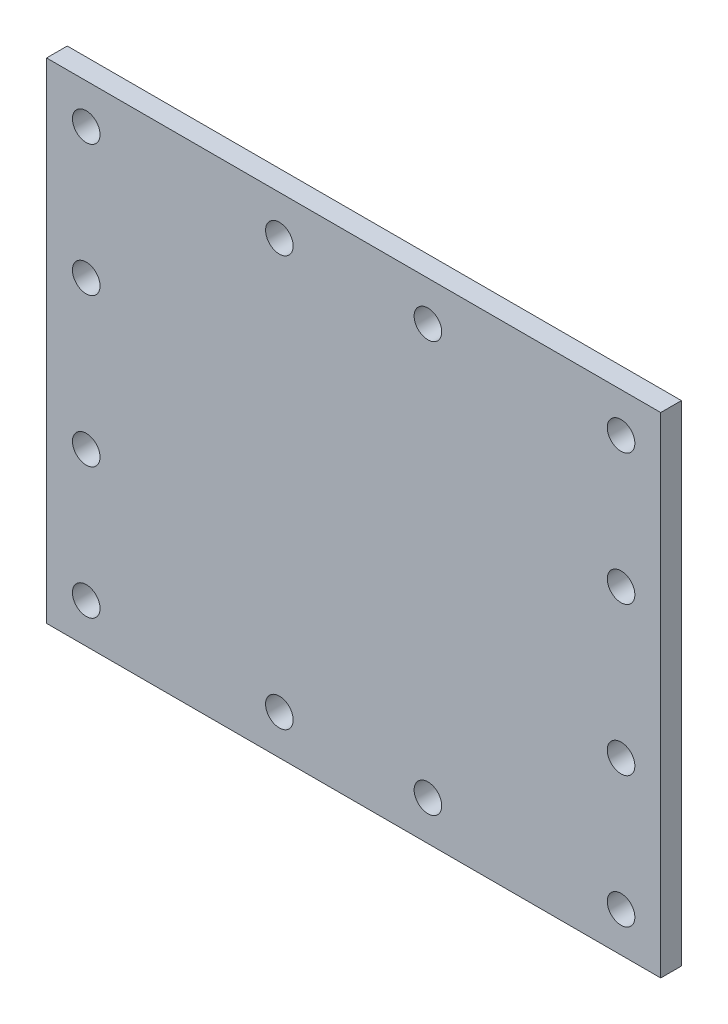
ISO-10303-21;
HEADER;
FILE_DESCRIPTION(('STEP AP214'),'2;1');
FILE_NAME('part.step','',(''),(''),'','','');
FILE_SCHEMA(('AUTOMOTIVE_DESIGN { 1 0 10303 214 1 1 1 1 }'));
ENDSEC;
DATA;
#1=APPLICATION_CONTEXT('core data for automotive mechanical design processes');
#2=APPLICATION_PROTOCOL_DEFINITION('international standard','automotive_design',2000,#1);
#3=PRODUCT_CONTEXT('',#1,'mechanical');
#4=PRODUCT('Part','Part','',(#3));
#5=PRODUCT_RELATED_PRODUCT_CATEGORY('part','',(#4));
#6=PRODUCT_DEFINITION_FORMATION('','',#4);
#7=PRODUCT_DEFINITION_CONTEXT('part definition',#1,'design');
#8=PRODUCT_DEFINITION('design','',#6,#7);
#9=PRODUCT_DEFINITION_SHAPE('','',#8);
#10=(LENGTH_UNIT() NAMED_UNIT(*) SI_UNIT(.MILLI.,.METRE.));
#11=(NAMED_UNIT(*) PLANE_ANGLE_UNIT() SI_UNIT($,.RADIAN.));
#12=(NAMED_UNIT(*) SI_UNIT($,.STERADIAN.) SOLID_ANGLE_UNIT());
#13=UNCERTAINTY_MEASURE_WITH_UNIT(LENGTH_MEASURE(1.E-05),#10,'distance_accuracy_value','');
#14=(GEOMETRIC_REPRESENTATION_CONTEXT(3) GLOBAL_UNCERTAINTY_ASSIGNED_CONTEXT((#13)) GLOBAL_UNIT_ASSIGNED_CONTEXT((#10,
#11,#12)) REPRESENTATION_CONTEXT('',''));
#15=CARTESIAN_POINT('',(0.,0.,0.));
#16=DIRECTION('',(0.,0.,1.));
#17=DIRECTION('',(1.,0.,0.));
#18=AXIS2_PLACEMENT_3D('',#15,#16,#17);
#19=CARTESIAN_POINT('',(-146.414312824647,106.491954424767,-2.51040500289528));
#20=DIRECTION('',(0.,1.,0.));
#21=DIRECTION('',(-1.,0.,0.));
#22=AXIS2_PLACEMENT_3D('',#19,#20,#21);
#23=PLANE('',#22);
#24=DIRECTION('',(1.,0.,0.));
#25=VECTOR('',#24,1.);
#26=CARTESIAN_POINT('',(-146.414312824647,106.491954424767,-5.51040500289528));
#27=LINE('',#26,#25);
#28=CARTESIAN_POINT('',(-146.414312824647,106.491954424767,-5.51040500289528));
#29=VERTEX_POINT('',#28);
#30=CARTESIAN_POINT('',(-57.3743128246472,106.491954424767,-5.51040500289528));
#31=VERTEX_POINT('',#30);
#32=EDGE_CURVE('E100',#29,#31,#27,.T.);
#33=ORIENTED_EDGE('',*,*,#32,.F.);
#34=DIRECTION('',(0.,0.,-1.));
#35=VECTOR('',#34,1.);
#36=CARTESIAN_POINT('',(-146.414312824647,106.491954424767,-2.51040500289528));
#37=LINE('',#36,#35);
#38=CARTESIAN_POINT('',(-146.414312824647,106.491954424767,-2.51040500289528));
#39=VERTEX_POINT('',#38);
#40=EDGE_CURVE('E11',#39,#29,#37,.T.);
#41=ORIENTED_EDGE('',*,*,#40,.F.);
#42=DIRECTION('',(1.,0.,0.));
#43=VECTOR('',#42,1.);
#44=CARTESIAN_POINT('',(-146.414312824647,106.491954424767,-2.51040500289528));
#45=LINE('',#44,#43);
#46=CARTESIAN_POINT('',(-57.3743128246472,106.491954424767,-2.51040500289528));
#47=VERTEX_POINT('',#46);
#48=EDGE_CURVE('E93',#39,#47,#45,.T.);
#49=ORIENTED_EDGE('',*,*,#48,.T.);
#50=DIRECTION('',(0.,0.,-1.));
#51=VECTOR('',#50,1.);
#52=CARTESIAN_POINT('',(-57.3743128246472,106.491954424767,-2.51040500289528));
#53=LINE('',#52,#51);
#54=EDGE_CURVE('E38',#47,#31,#53,.T.);
#55=ORIENTED_EDGE('',*,*,#54,.T.);
#56=EDGE_LOOP('',(#33,#41,#49,#55));
#57=FACE_BOUND('',#56,.T.);
#58=ADVANCED_FACE('F35',(#57),#23,.T.);
#59=CARTESIAN_POINT('',(-146.414312824647,35.4943544247679,-2.51040500289528));
#60=DIRECTION('',(-1.,0.,0.));
#61=DIRECTION('',(0.,0.,1.));
#62=AXIS2_PLACEMENT_3D('',#59,#60,#61);
#63=PLANE('',#62);
#64=DIRECTION('',(0.,1.,0.));
#65=VECTOR('',#64,1.);
#66=CARTESIAN_POINT('',(-146.414312824647,35.4943544247679,-5.51040500289528));
#67=LINE('',#66,#65);
#68=CARTESIAN_POINT('',(-146.414312824647,35.4943544247679,-5.51040500289528));
#69=VERTEX_POINT('',#68);
#70=EDGE_CURVE('E95',#69,#29,#67,.T.);
#71=ORIENTED_EDGE('',*,*,#70,.F.);
#72=DIRECTION('',(0.,0.,-1.));
#73=VECTOR('',#72,1.);
#74=CARTESIAN_POINT('',(-146.414312824647,35.4943544247679,-2.51040500289528));
#75=LINE('',#74,#73);
#76=CARTESIAN_POINT('',(-146.414312824647,35.4943544247679,-2.51040500289528));
#77=VERTEX_POINT('',#76);
#78=EDGE_CURVE('E44',#77,#69,#75,.T.);
#79=ORIENTED_EDGE('',*,*,#78,.F.);
#80=DIRECTION('',(0.,1.,0.));
#81=VECTOR('',#80,1.);
#82=CARTESIAN_POINT('',(-146.414312824647,35.4943544247679,-2.51040500289528));
#83=LINE('',#82,#81);
#84=EDGE_CURVE('E90',#77,#39,#83,.T.);
#85=ORIENTED_EDGE('',*,*,#84,.T.);
#86=ORIENTED_EDGE('',*,*,#40,.T.);
#87=EDGE_LOOP('',(#71,#79,#85,#86));
#88=FACE_BOUND('',#87,.T.);
#89=ADVANCED_FACE('F111',(#88),#63,.T.);
#90=CARTESIAN_POINT('',(-57.3743128246472,35.4943544247679,-2.51040500289528));
#91=DIRECTION('',(0.,-1.,0.));
#92=DIRECTION('',(1.,0.,0.));
#93=AXIS2_PLACEMENT_3D('',#90,#91,#92);
#94=PLANE('',#93);
#95=DIRECTION('',(-1.,0.,0.));
#96=VECTOR('',#95,1.);
#97=CARTESIAN_POINT('',(-57.3743128246472,35.4943544247679,-5.51040500289528));
#98=LINE('',#97,#96);
#99=CARTESIAN_POINT('',(-57.3743128246472,35.4943544247679,-5.51040500289528));
#100=VERTEX_POINT('',#99);
#101=EDGE_CURVE('E85',#100,#69,#98,.T.);
#102=ORIENTED_EDGE('',*,*,#101,.F.);
#103=DIRECTION('',(0.,0.,-1.));
#104=VECTOR('',#103,1.);
#105=CARTESIAN_POINT('',(-57.3743128246472,35.4943544247679,-2.51040500289528));
#106=LINE('',#105,#104);
#107=CARTESIAN_POINT('',(-57.3743128246472,35.4943544247679,-2.51040500289528));
#108=VERTEX_POINT('',#107);
#109=EDGE_CURVE('E80',#108,#100,#106,.T.);
#110=ORIENTED_EDGE('',*,*,#109,.F.);
#111=DIRECTION('',(-1.,0.,0.));
#112=VECTOR('',#111,1.);
#113=CARTESIAN_POINT('',(-57.3743128246472,35.4943544247679,-2.51040500289528));
#114=LINE('',#113,#112);
#115=EDGE_CURVE('E83',#108,#77,#114,.T.);
#116=ORIENTED_EDGE('',*,*,#115,.T.);
#117=ORIENTED_EDGE('',*,*,#78,.T.);
#118=EDGE_LOOP('',(#102,#110,#116,#117));
#119=FACE_BOUND('',#118,.T.);
#120=ADVANCED_FACE('F82',(#119),#94,.T.);
#121=CARTESIAN_POINT('',(-57.3743128246472,106.491954424767,-2.51040500289528));
#122=DIRECTION('',(1.,0.,0.));
#123=DIRECTION('',(0.,1.,0.));
#124=AXIS2_PLACEMENT_3D('',#121,#122,#123);
#125=PLANE('',#124);
#126=DIRECTION('',(0.,-1.,0.));
#127=VECTOR('',#126,1.);
#128=CARTESIAN_POINT('',(-57.3743128246472,106.491954424767,-5.51040500289528));
#129=LINE('',#128,#127);
#130=EDGE_CURVE('E103',#31,#100,#129,.T.);
#131=ORIENTED_EDGE('',*,*,#130,.F.);
#132=ORIENTED_EDGE('',*,*,#54,.F.);
#133=DIRECTION('',(0.,-1.,0.));
#134=VECTOR('',#133,1.);
#135=CARTESIAN_POINT('',(-57.3743128246472,106.491954424767,-2.51040500289528));
#136=LINE('',#135,#134);
#137=EDGE_CURVE('E89',#47,#108,#136,.T.);
#138=ORIENTED_EDGE('',*,*,#137,.T.);
#139=ORIENTED_EDGE('',*,*,#109,.T.);
#140=EDGE_LOOP('',(#131,#132,#138,#139));
#141=FACE_BOUND('',#140,.T.);
#142=ADVANCED_FACE('F92',(#141),#125,.T.);
#143=CARTESIAN_POINT('',(0.,0.,-2.51040500289528));
#144=DIRECTION('',(0.,0.,-1.));
#145=DIRECTION('',(-1.,0.,0.));
#146=AXIS2_PLACEMENT_3D('',#143,#144,#145);
#147=PLANE('',#146);
#148=CARTESIAN_POINT('',(-112.664312824647,100.741954424767,-2.51040500289528));
#149=DIRECTION('',(0.,0.,-1.));
#150=DIRECTION('',(-1.,0.,0.));
#151=AXIS2_PLACEMENT_3D('',#148,#149,#150);
#152=CIRCLE('',#151,2.);
#153=CARTESIAN_POINT('',(-114.664312824647,100.741954424767,-2.51040500289528));
#154=VERTEX_POINT('',#153);
#155=EDGE_CURVE('E184',#154,#154,#152,.T.);
#156=ORIENTED_EDGE('',*,*,#155,.T.);
#157=EDGE_LOOP('',(#156));
#158=FACE_BOUND('',#157,.T.);
#159=CARTESIAN_POINT('',(-91.1243128246472,100.741954424767,-2.51040500289528));
#160=DIRECTION('',(0.,0.,-1.));
#161=DIRECTION('',(-1.,0.,0.));
#162=AXIS2_PLACEMENT_3D('',#159,#160,#161);
#163=CIRCLE('',#162,2.);
#164=CARTESIAN_POINT('',(-93.1243128246472,100.741954424767,-2.51040500289528));
#165=VERTEX_POINT('',#164);
#166=EDGE_CURVE('E192',#165,#165,#163,.T.);
#167=ORIENTED_EDGE('',*,*,#166,.T.);
#168=EDGE_LOOP('',(#167));
#169=FACE_BOUND('',#168,.T.);
#170=CARTESIAN_POINT('',(-63.1243128246472,100.741954424767,-2.51040500289528));
#171=DIRECTION('',(0.,0.,-1.));
#172=DIRECTION('',(-1.,0.,0.));
#173=AXIS2_PLACEMENT_3D('',#170,#171,#172);
#174=CIRCLE('',#173,1.99999999999998);
#175=CARTESIAN_POINT('',(-65.1243128246472,100.741954424767,-2.51040500289528));
#176=VERTEX_POINT('',#175);
#177=EDGE_CURVE('E198',#176,#176,#174,.T.);
#178=ORIENTED_EDGE('',*,*,#177,.T.);
#179=EDGE_LOOP('',(#178));
#180=FACE_BOUND('',#179,.T.);
#181=CARTESIAN_POINT('',(-63.1243128246471,81.7419544247674,-2.51040500289528));
#182=DIRECTION('',(0.,0.,-1.));
#183=DIRECTION('',(-1.,0.,0.));
#184=AXIS2_PLACEMENT_3D('',#181,#182,#183);
#185=CIRCLE('',#184,1.99999999999998);
#186=CARTESIAN_POINT('',(-65.1243128246471,81.7419544247674,-2.51040500289528));
#187=VERTEX_POINT('',#186);
#188=EDGE_CURVE('E204',#187,#187,#185,.T.);
#189=ORIENTED_EDGE('',*,*,#188,.T.);
#190=EDGE_LOOP('',(#189));
#191=FACE_BOUND('',#190,.T.);
#192=CARTESIAN_POINT('',(-63.1243128246471,60.2443544247679,-2.51040500289528));
#193=DIRECTION('',(0.,0.,-1.));
#194=DIRECTION('',(-1.,0.,0.));
#195=AXIS2_PLACEMENT_3D('',#192,#193,#194);
#196=CIRCLE('',#195,1.99999999999998);
#197=CARTESIAN_POINT('',(-65.1243128246471,60.2443544247679,-2.51040500289528));
#198=VERTEX_POINT('',#197);
#199=EDGE_CURVE('E210',#198,#198,#196,.T.);
#200=ORIENTED_EDGE('',*,*,#199,.T.);
#201=EDGE_LOOP('',(#200));
#202=FACE_BOUND('',#201,.T.);
#203=CARTESIAN_POINT('',(-63.1243128246472,41.2443544247679,-2.51040500289528));
#204=DIRECTION('',(0.,0.,-1.));
#205=DIRECTION('',(-1.,0.,0.));
#206=AXIS2_PLACEMENT_3D('',#203,#204,#205);
#207=CIRCLE('',#206,1.99999999999998);
#208=CARTESIAN_POINT('',(-65.1243128246472,41.2443544247679,-2.51040500289528));
#209=VERTEX_POINT('',#208);
#210=EDGE_CURVE('E216',#209,#209,#207,.T.);
#211=ORIENTED_EDGE('',*,*,#210,.T.);
#212=EDGE_LOOP('',(#211));
#213=FACE_BOUND('',#212,.T.);
#214=CARTESIAN_POINT('',(-91.1243128246472,41.2443544247679,-2.51040500289528));
#215=DIRECTION('',(0.,0.,-1.));
#216=DIRECTION('',(-1.,0.,0.));
#217=AXIS2_PLACEMENT_3D('',#214,#215,#216);
#218=CIRCLE('',#217,2.);
#219=CARTESIAN_POINT('',(-93.1243128246472,41.2443544247679,-2.51040500289528));
#220=VERTEX_POINT('',#219);
#221=EDGE_CURVE('E222',#220,#220,#218,.T.);
#222=ORIENTED_EDGE('',*,*,#221,.T.);
#223=EDGE_LOOP('',(#222));
#224=FACE_BOUND('',#223,.T.);
#225=CARTESIAN_POINT('',(-112.664312824647,41.2443544247679,-2.51040500289528));
#226=DIRECTION('',(0.,0.,-1.));
#227=DIRECTION('',(-1.,0.,0.));
#228=AXIS2_PLACEMENT_3D('',#225,#226,#227);
#229=CIRCLE('',#228,2.);
#230=CARTESIAN_POINT('',(-114.664312824647,41.2443544247679,-2.51040500289528));
#231=VERTEX_POINT('',#230);
#232=EDGE_CURVE('E228',#231,#231,#229,.T.);
#233=ORIENTED_EDGE('',*,*,#232,.T.);
#234=EDGE_LOOP('',(#233));
#235=FACE_BOUND('',#234,.T.);
#236=CARTESIAN_POINT('',(-140.664312824647,41.2443544247679,-2.51040500289528));
#237=DIRECTION('',(0.,0.,-1.));
#238=DIRECTION('',(-1.,0.,0.));
#239=AXIS2_PLACEMENT_3D('',#236,#237,#238);
#240=CIRCLE('',#239,2.);
#241=CARTESIAN_POINT('',(-142.664312824647,41.2443544247679,-2.51040500289528));
#242=VERTEX_POINT('',#241);
#243=EDGE_CURVE('E234',#242,#242,#240,.T.);
#244=ORIENTED_EDGE('',*,*,#243,.T.);
#245=EDGE_LOOP('',(#244));
#246=FACE_BOUND('',#245,.T.);
#247=CARTESIAN_POINT('',(-140.664312824647,60.2443544247679,-2.51040500289528));
#248=DIRECTION('',(0.,0.,-1.));
#249=DIRECTION('',(-1.,0.,0.));
#250=AXIS2_PLACEMENT_3D('',#247,#248,#249);
#251=CIRCLE('',#250,2.);
#252=CARTESIAN_POINT('',(-142.664312824647,60.2443544247679,-2.51040500289528));
#253=VERTEX_POINT('',#252);
#254=EDGE_CURVE('E240',#253,#253,#251,.T.);
#255=ORIENTED_EDGE('',*,*,#254,.T.);
#256=EDGE_LOOP('',(#255));
#257=FACE_BOUND('',#256,.T.);
#258=CARTESIAN_POINT('',(-140.664312824647,100.741954424767,-2.51040500289528));
#259=DIRECTION('',(0.,0.,-1.));
#260=DIRECTION('',(-1.,0.,0.));
#261=AXIS2_PLACEMENT_3D('',#258,#259,#260);
#262=CIRCLE('',#261,2.);
#263=CARTESIAN_POINT('',(-142.664312824647,100.741954424767,-2.51040500289528));
#264=VERTEX_POINT('',#263);
#265=EDGE_CURVE('E246',#264,#264,#262,.T.);
#266=ORIENTED_EDGE('',*,*,#265,.T.);
#267=EDGE_LOOP('',(#266));
#268=FACE_BOUND('',#267,.T.);
#269=CARTESIAN_POINT('',(-140.664312824647,81.7419544247674,-2.51040500289528));
#270=DIRECTION('',(0.,0.,-1.));
#271=DIRECTION('',(-1.,0.,0.));
#272=AXIS2_PLACEMENT_3D('',#269,#270,#271);
#273=CIRCLE('',#272,2.);
#274=CARTESIAN_POINT('',(-142.664312824647,81.7419544247674,-2.51040500289528));
#275=VERTEX_POINT('',#274);
#276=EDGE_CURVE('E104',#275,#275,#273,.T.);
#277=ORIENTED_EDGE('',*,*,#276,.T.);
#278=EDGE_LOOP('',(#277));
#279=FACE_BOUND('',#278,.T.);
#280=ORIENTED_EDGE('',*,*,#48,.F.);
#281=ORIENTED_EDGE('',*,*,#84,.F.);
#282=ORIENTED_EDGE('',*,*,#115,.F.);
#283=ORIENTED_EDGE('',*,*,#137,.F.);
#284=EDGE_LOOP('',(#280,#281,#282,#283));
#285=FACE_BOUND('',#284,.T.);
#286=ADVANCED_FACE('F88',(#158,#169,#180,#191,#202,#213,#224,#235,#246,#257,#268,#279,#285),
#147,.F.);
#287=CARTESIAN_POINT('',(0.,0.,-5.51040500289528));
#288=DIRECTION('',(0.,0.,-1.));
#289=DIRECTION('',(-1.,0.,0.));
#290=AXIS2_PLACEMENT_3D('',#287,#288,#289);
#291=PLANE('',#290);
#292=CARTESIAN_POINT('',(-112.664312824647,100.741954424767,-5.51040500289528));
#293=DIRECTION('',(0.,0.,-1.));
#294=DIRECTION('',(-1.,0.,0.));
#295=AXIS2_PLACEMENT_3D('',#292,#293,#294);
#296=CIRCLE('',#295,2.);
#297=CARTESIAN_POINT('',(-114.664312824647,100.741954424767,-5.51040500289528));
#298=VERTEX_POINT('',#297);
#299=EDGE_CURVE('E187',#298,#298,#296,.T.);
#300=ORIENTED_EDGE('',*,*,#299,.F.);
#301=EDGE_LOOP('',(#300));
#302=FACE_BOUND('',#301,.T.);
#303=CARTESIAN_POINT('',(-91.1243128246472,100.741954424767,-5.51040500289528));
#304=DIRECTION('',(0.,0.,-1.));
#305=DIRECTION('',(-1.,0.,0.));
#306=AXIS2_PLACEMENT_3D('',#303,#304,#305);
#307=CIRCLE('',#306,2.);
#308=CARTESIAN_POINT('',(-93.1243128246472,100.741954424767,-5.51040500289528));
#309=VERTEX_POINT('',#308);
#310=EDGE_CURVE('E189',#309,#309,#307,.T.);
#311=ORIENTED_EDGE('',*,*,#310,.F.);
#312=EDGE_LOOP('',(#311));
#313=FACE_BOUND('',#312,.T.);
#314=CARTESIAN_POINT('',(-63.1243128246472,100.741954424767,-5.51040500289528));
#315=DIRECTION('',(0.,0.,-1.));
#316=DIRECTION('',(-1.,0.,0.));
#317=AXIS2_PLACEMENT_3D('',#314,#315,#316);
#318=CIRCLE('',#317,1.99999999999998);
#319=CARTESIAN_POINT('',(-65.1243128246472,100.741954424767,-5.51040500289528));
#320=VERTEX_POINT('',#319);
#321=EDGE_CURVE('E195',#320,#320,#318,.T.);
#322=ORIENTED_EDGE('',*,*,#321,.F.);
#323=EDGE_LOOP('',(#322));
#324=FACE_BOUND('',#323,.T.);
#325=CARTESIAN_POINT('',(-63.1243128246471,81.7419544247674,-5.51040500289528));
#326=DIRECTION('',(0.,0.,-1.));
#327=DIRECTION('',(-1.,0.,0.));
#328=AXIS2_PLACEMENT_3D('',#325,#326,#327);
#329=CIRCLE('',#328,1.99999999999998);
#330=CARTESIAN_POINT('',(-65.1243128246471,81.7419544247674,-5.51040500289528));
#331=VERTEX_POINT('',#330);
#332=EDGE_CURVE('E201',#331,#331,#329,.T.);
#333=ORIENTED_EDGE('',*,*,#332,.F.);
#334=EDGE_LOOP('',(#333));
#335=FACE_BOUND('',#334,.T.);
#336=CARTESIAN_POINT('',(-63.1243128246471,60.2443544247679,-5.51040500289528));
#337=DIRECTION('',(0.,0.,-1.));
#338=DIRECTION('',(-1.,0.,0.));
#339=AXIS2_PLACEMENT_3D('',#336,#337,#338);
#340=CIRCLE('',#339,1.99999999999998);
#341=CARTESIAN_POINT('',(-65.1243128246471,60.2443544247679,-5.51040500289528));
#342=VERTEX_POINT('',#341);
#343=EDGE_CURVE('E207',#342,#342,#340,.T.);
#344=ORIENTED_EDGE('',*,*,#343,.F.);
#345=EDGE_LOOP('',(#344));
#346=FACE_BOUND('',#345,.T.);
#347=CARTESIAN_POINT('',(-63.1243128246472,41.2443544247679,-5.51040500289528));
#348=DIRECTION('',(0.,0.,-1.));
#349=DIRECTION('',(-1.,0.,0.));
#350=AXIS2_PLACEMENT_3D('',#347,#348,#349);
#351=CIRCLE('',#350,1.99999999999998);
#352=CARTESIAN_POINT('',(-65.1243128246472,41.2443544247679,-5.51040500289528));
#353=VERTEX_POINT('',#352);
#354=EDGE_CURVE('E213',#353,#353,#351,.T.);
#355=ORIENTED_EDGE('',*,*,#354,.F.);
#356=EDGE_LOOP('',(#355));
#357=FACE_BOUND('',#356,.T.);
#358=CARTESIAN_POINT('',(-91.1243128246472,41.2443544247679,-5.51040500289528));
#359=DIRECTION('',(0.,0.,-1.));
#360=DIRECTION('',(-1.,0.,0.));
#361=AXIS2_PLACEMENT_3D('',#358,#359,#360);
#362=CIRCLE('',#361,2.);
#363=CARTESIAN_POINT('',(-93.1243128246472,41.2443544247679,-5.51040500289528));
#364=VERTEX_POINT('',#363);
#365=EDGE_CURVE('E219',#364,#364,#362,.T.);
#366=ORIENTED_EDGE('',*,*,#365,.F.);
#367=EDGE_LOOP('',(#366));
#368=FACE_BOUND('',#367,.T.);
#369=CARTESIAN_POINT('',(-112.664312824647,41.2443544247679,-5.51040500289528));
#370=DIRECTION('',(0.,0.,-1.));
#371=DIRECTION('',(-1.,0.,0.));
#372=AXIS2_PLACEMENT_3D('',#369,#370,#371);
#373=CIRCLE('',#372,2.);
#374=CARTESIAN_POINT('',(-114.664312824647,41.2443544247679,-5.51040500289528));
#375=VERTEX_POINT('',#374);
#376=EDGE_CURVE('E225',#375,#375,#373,.T.);
#377=ORIENTED_EDGE('',*,*,#376,.F.);
#378=EDGE_LOOP('',(#377));
#379=FACE_BOUND('',#378,.T.);
#380=CARTESIAN_POINT('',(-140.664312824647,41.2443544247679,-5.51040500289528));
#381=DIRECTION('',(0.,0.,-1.));
#382=DIRECTION('',(-1.,0.,0.));
#383=AXIS2_PLACEMENT_3D('',#380,#381,#382);
#384=CIRCLE('',#383,2.);
#385=CARTESIAN_POINT('',(-142.664312824647,41.2443544247679,-5.51040500289528));
#386=VERTEX_POINT('',#385);
#387=EDGE_CURVE('E231',#386,#386,#384,.T.);
#388=ORIENTED_EDGE('',*,*,#387,.F.);
#389=EDGE_LOOP('',(#388));
#390=FACE_BOUND('',#389,.T.);
#391=CARTESIAN_POINT('',(-140.664312824647,60.2443544247679,-5.51040500289528));
#392=DIRECTION('',(0.,0.,-1.));
#393=DIRECTION('',(-1.,0.,0.));
#394=AXIS2_PLACEMENT_3D('',#391,#392,#393);
#395=CIRCLE('',#394,2.);
#396=CARTESIAN_POINT('',(-142.664312824647,60.2443544247679,-5.51040500289528));
#397=VERTEX_POINT('',#396);
#398=EDGE_CURVE('E237',#397,#397,#395,.T.);
#399=ORIENTED_EDGE('',*,*,#398,.F.);
#400=EDGE_LOOP('',(#399));
#401=FACE_BOUND('',#400,.T.);
#402=CARTESIAN_POINT('',(-140.664312824647,100.741954424767,-5.51040500289528));
#403=DIRECTION('',(0.,0.,-1.));
#404=DIRECTION('',(-1.,0.,0.));
#405=AXIS2_PLACEMENT_3D('',#402,#403,#404);
#406=CIRCLE('',#405,2.);
#407=CARTESIAN_POINT('',(-142.664312824647,100.741954424767,-5.51040500289528));
#408=VERTEX_POINT('',#407);
#409=EDGE_CURVE('E243',#408,#408,#406,.T.);
#410=ORIENTED_EDGE('',*,*,#409,.F.);
#411=EDGE_LOOP('',(#410));
#412=FACE_BOUND('',#411,.T.);
#413=CARTESIAN_POINT('',(-140.664312824647,81.7419544247674,-5.51040500289528));
#414=DIRECTION('',(0.,0.,-1.));
#415=DIRECTION('',(-1.,0.,0.));
#416=AXIS2_PLACEMENT_3D('',#413,#414,#415);
#417=CIRCLE('',#416,2.);
#418=CARTESIAN_POINT('',(-142.664312824647,81.7419544247674,-5.51040500289528));
#419=VERTEX_POINT('',#418);
#420=EDGE_CURVE('E249',#419,#419,#417,.T.);
#421=ORIENTED_EDGE('',*,*,#420,.F.);
#422=EDGE_LOOP('',(#421));
#423=FACE_BOUND('',#422,.T.);
#424=ORIENTED_EDGE('',*,*,#32,.T.);
#425=ORIENTED_EDGE('',*,*,#130,.T.);
#426=ORIENTED_EDGE('',*,*,#101,.T.);
#427=ORIENTED_EDGE('',*,*,#70,.T.);
#428=EDGE_LOOP('',(#424,#425,#426,#427));
#429=FACE_BOUND('',#428,.T.);
#430=ADVANCED_FACE('F110',(#302,#313,#324,#335,#346,#357,#368,#379,#390,#401,#412,#423,#429),
#291,.T.);
#431=CARTESIAN_POINT('',(-140.664312824647,81.7419544247674,-2.51040500289528));
#432=DIRECTION('',(0.,0.,-1.));
#433=DIRECTION('',(-1.,0.,0.));
#434=AXIS2_PLACEMENT_3D('',#431,#432,#433);
#435=CYLINDRICAL_SURFACE('',#434,2.);
#436=ORIENTED_EDGE('',*,*,#276,.F.);
#437=EDGE_LOOP('',(#436));
#438=FACE_BOUND('',#437,.T.);
#439=ORIENTED_EDGE('',*,*,#420,.T.);
#440=EDGE_LOOP('',(#439));
#441=FACE_BOUND('',#440,.T.);
#442=ADVANCED_FACE('F129',(#438,#441),#435,.F.);
#443=CARTESIAN_POINT('',(-140.664312824647,100.741954424767,-2.51040500289528));
#444=DIRECTION('',(0.,0.,-1.));
#445=DIRECTION('',(-1.,0.,0.));
#446=AXIS2_PLACEMENT_3D('',#443,#444,#445);
#447=CYLINDRICAL_SURFACE('',#446,2.);
#448=ORIENTED_EDGE('',*,*,#265,.F.);
#449=EDGE_LOOP('',(#448));
#450=FACE_BOUND('',#449,.T.);
#451=ORIENTED_EDGE('',*,*,#409,.T.);
#452=EDGE_LOOP('',(#451));
#453=FACE_BOUND('',#452,.T.);
#454=ADVANCED_FACE('F136',(#450,#453),#447,.F.);
#455=CARTESIAN_POINT('',(-140.664312824647,60.2443544247679,-2.51040500289528));
#456=DIRECTION('',(0.,0.,-1.));
#457=DIRECTION('',(-1.,0.,0.));
#458=AXIS2_PLACEMENT_3D('',#455,#456,#457);
#459=CYLINDRICAL_SURFACE('',#458,2.);
#460=ORIENTED_EDGE('',*,*,#254,.F.);
#461=EDGE_LOOP('',(#460));
#462=FACE_BOUND('',#461,.T.);
#463=ORIENTED_EDGE('',*,*,#398,.T.);
#464=EDGE_LOOP('',(#463));
#465=FACE_BOUND('',#464,.T.);
#466=ADVANCED_FACE('F140',(#462,#465),#459,.F.);
#467=CARTESIAN_POINT('',(-140.664312824647,41.2443544247679,-2.51040500289528));
#468=DIRECTION('',(0.,0.,-1.));
#469=DIRECTION('',(-1.,0.,0.));
#470=AXIS2_PLACEMENT_3D('',#467,#468,#469);
#471=CYLINDRICAL_SURFACE('',#470,2.);
#472=ORIENTED_EDGE('',*,*,#243,.F.);
#473=EDGE_LOOP('',(#472));
#474=FACE_BOUND('',#473,.T.);
#475=ORIENTED_EDGE('',*,*,#387,.T.);
#476=EDGE_LOOP('',(#475));
#477=FACE_BOUND('',#476,.T.);
#478=ADVANCED_FACE('F144',(#474,#477),#471,.F.);
#479=CARTESIAN_POINT('',(-112.664312824647,41.2443544247679,-2.51040500289528));
#480=DIRECTION('',(0.,0.,-1.));
#481=DIRECTION('',(-1.,0.,0.));
#482=AXIS2_PLACEMENT_3D('',#479,#480,#481);
#483=CYLINDRICAL_SURFACE('',#482,2.);
#484=ORIENTED_EDGE('',*,*,#232,.F.);
#485=EDGE_LOOP('',(#484));
#486=FACE_BOUND('',#485,.T.);
#487=ORIENTED_EDGE('',*,*,#376,.T.);
#488=EDGE_LOOP('',(#487));
#489=FACE_BOUND('',#488,.T.);
#490=ADVANCED_FACE('F148',(#486,#489),#483,.F.);
#491=CARTESIAN_POINT('',(-91.1243128246472,41.2443544247679,-2.51040500289528));
#492=DIRECTION('',(0.,0.,-1.));
#493=DIRECTION('',(-1.,0.,0.));
#494=AXIS2_PLACEMENT_3D('',#491,#492,#493);
#495=CYLINDRICAL_SURFACE('',#494,2.);
#496=ORIENTED_EDGE('',*,*,#221,.F.);
#497=EDGE_LOOP('',(#496));
#498=FACE_BOUND('',#497,.T.);
#499=ORIENTED_EDGE('',*,*,#365,.T.);
#500=EDGE_LOOP('',(#499));
#501=FACE_BOUND('',#500,.T.);
#502=ADVANCED_FACE('F152',(#498,#501),#495,.F.);
#503=CARTESIAN_POINT('',(-63.1243128246472,41.2443544247679,-2.51040500289528));
#504=DIRECTION('',(0.,0.,-1.));
#505=DIRECTION('',(-1.,0.,0.));
#506=AXIS2_PLACEMENT_3D('',#503,#504,#505);
#507=CYLINDRICAL_SURFACE('',#506,1.99999999999998);
#508=ORIENTED_EDGE('',*,*,#210,.F.);
#509=EDGE_LOOP('',(#508));
#510=FACE_BOUND('',#509,.T.);
#511=ORIENTED_EDGE('',*,*,#354,.T.);
#512=EDGE_LOOP('',(#511));
#513=FACE_BOUND('',#512,.T.);
#514=ADVANCED_FACE('F156',(#510,#513),#507,.F.);
#515=CARTESIAN_POINT('',(-63.1243128246471,60.2443544247679,-2.51040500289528));
#516=DIRECTION('',(0.,0.,-1.));
#517=DIRECTION('',(-1.,0.,0.));
#518=AXIS2_PLACEMENT_3D('',#515,#516,#517);
#519=CYLINDRICAL_SURFACE('',#518,1.99999999999998);
#520=ORIENTED_EDGE('',*,*,#199,.F.);
#521=EDGE_LOOP('',(#520));
#522=FACE_BOUND('',#521,.T.);
#523=ORIENTED_EDGE('',*,*,#343,.T.);
#524=EDGE_LOOP('',(#523));
#525=FACE_BOUND('',#524,.T.);
#526=ADVANCED_FACE('F160',(#522,#525),#519,.F.);
#527=CARTESIAN_POINT('',(-63.1243128246471,81.7419544247674,-2.51040500289528));
#528=DIRECTION('',(0.,0.,-1.));
#529=DIRECTION('',(-1.,0.,0.));
#530=AXIS2_PLACEMENT_3D('',#527,#528,#529);
#531=CYLINDRICAL_SURFACE('',#530,1.99999999999998);
#532=ORIENTED_EDGE('',*,*,#188,.F.);
#533=EDGE_LOOP('',(#532));
#534=FACE_BOUND('',#533,.T.);
#535=ORIENTED_EDGE('',*,*,#332,.T.);
#536=EDGE_LOOP('',(#535));
#537=FACE_BOUND('',#536,.T.);
#538=ADVANCED_FACE('F164',(#534,#537),#531,.F.);
#539=CARTESIAN_POINT('',(-63.1243128246472,100.741954424767,-2.51040500289528));
#540=DIRECTION('',(0.,0.,-1.));
#541=DIRECTION('',(-1.,0.,0.));
#542=AXIS2_PLACEMENT_3D('',#539,#540,#541);
#543=CYLINDRICAL_SURFACE('',#542,1.99999999999998);
#544=ORIENTED_EDGE('',*,*,#177,.F.);
#545=EDGE_LOOP('',(#544));
#546=FACE_BOUND('',#545,.T.);
#547=ORIENTED_EDGE('',*,*,#321,.T.);
#548=EDGE_LOOP('',(#547));
#549=FACE_BOUND('',#548,.T.);
#550=ADVANCED_FACE('F168',(#546,#549),#543,.F.);
#551=CARTESIAN_POINT('',(-91.1243128246472,100.741954424767,-2.51040500289528));
#552=DIRECTION('',(0.,0.,-1.));
#553=DIRECTION('',(-1.,0.,0.));
#554=AXIS2_PLACEMENT_3D('',#551,#552,#553);
#555=CYLINDRICAL_SURFACE('',#554,2.);
#556=ORIENTED_EDGE('',*,*,#166,.F.);
#557=EDGE_LOOP('',(#556));
#558=FACE_BOUND('',#557,.T.);
#559=ORIENTED_EDGE('',*,*,#310,.T.);
#560=EDGE_LOOP('',(#559));
#561=FACE_BOUND('',#560,.T.);
#562=ADVANCED_FACE('F172',(#558,#561),#555,.F.);
#563=CARTESIAN_POINT('',(-112.664312824647,100.741954424767,-2.51040500289528));
#564=DIRECTION('',(0.,0.,-1.));
#565=DIRECTION('',(-1.,0.,0.));
#566=AXIS2_PLACEMENT_3D('',#563,#564,#565);
#567=CYLINDRICAL_SURFACE('',#566,2.);
#568=ORIENTED_EDGE('',*,*,#155,.F.);
#569=EDGE_LOOP('',(#568));
#570=FACE_BOUND('',#569,.T.);
#571=ORIENTED_EDGE('',*,*,#299,.T.);
#572=EDGE_LOOP('',(#571));
#573=FACE_BOUND('',#572,.T.);
#574=ADVANCED_FACE('F176',(#570,#573),#567,.F.);
#575=CLOSED_SHELL('',(#58,#89,#120,#142,#286,#430,#442,#454,#466,#478,#490,#502,#514,#526,#538,
#550,#562,#574));
#576=MANIFOLD_SOLID_BREP('B2',#575);
#577=ADVANCED_BREP_SHAPE_REPRESENTATION('',(#18,#576),#14);
#578=SHAPE_DEFINITION_REPRESENTATION(#9,#577);
ENDSEC;
END-ISO-10303-21;
